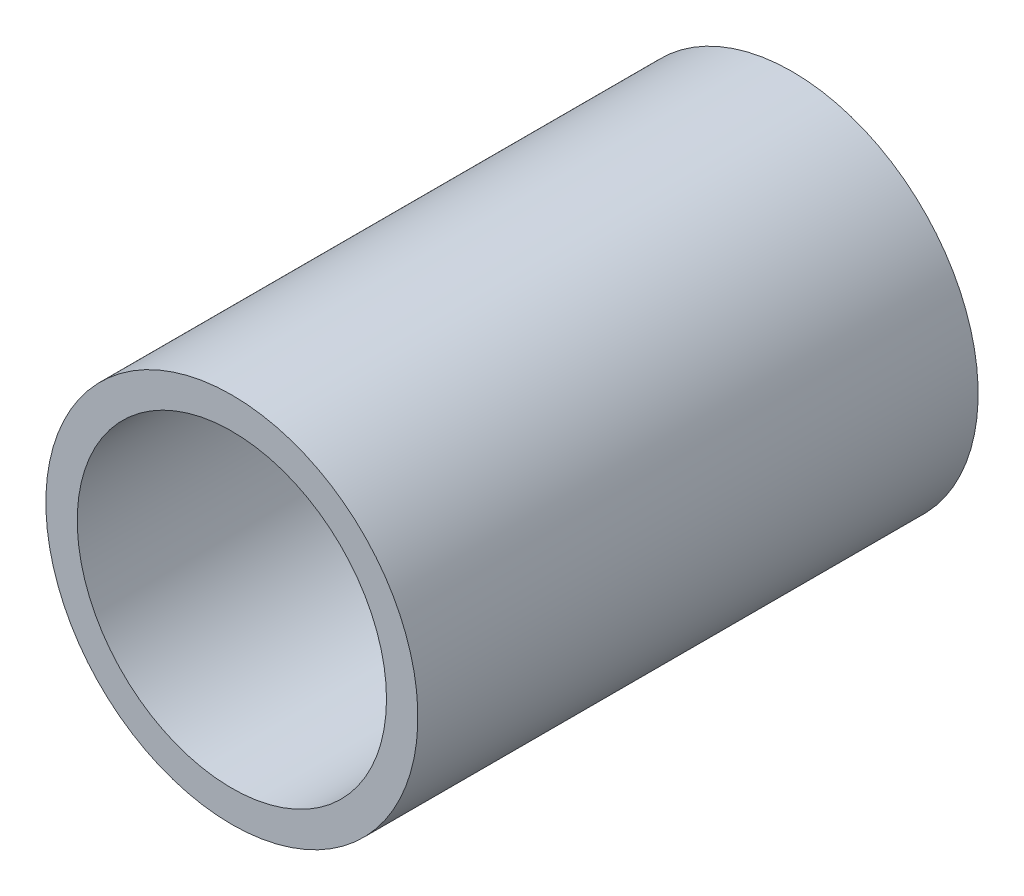
ISO-10303-21;
HEADER;
FILE_DESCRIPTION(('STEP AP214'),'2;1');
FILE_NAME('part.step','',(''),(''),'','','');
FILE_SCHEMA(('AUTOMOTIVE_DESIGN { 1 0 10303 214 1 1 1 1 }'));
ENDSEC;
DATA;
#1=APPLICATION_CONTEXT('core data for automotive mechanical design processes');
#2=APPLICATION_PROTOCOL_DEFINITION('international standard','automotive_design',2000,#1);
#3=PRODUCT_CONTEXT('',#1,'mechanical');
#4=PRODUCT('Part','Part','',(#3));
#5=PRODUCT_RELATED_PRODUCT_CATEGORY('part','',(#4));
#6=PRODUCT_DEFINITION_FORMATION('','',#4);
#7=PRODUCT_DEFINITION_CONTEXT('part definition',#1,'design');
#8=PRODUCT_DEFINITION('design','',#6,#7);
#9=PRODUCT_DEFINITION_SHAPE('','',#8);
#10=(LENGTH_UNIT() NAMED_UNIT(*) SI_UNIT(.MILLI.,.METRE.));
#11=(NAMED_UNIT(*) PLANE_ANGLE_UNIT() SI_UNIT($,.RADIAN.));
#12=(NAMED_UNIT(*) SI_UNIT($,.STERADIAN.) SOLID_ANGLE_UNIT());
#13=UNCERTAINTY_MEASURE_WITH_UNIT(LENGTH_MEASURE(1.E-05),#10,'distance_accuracy_value','');
#14=(GEOMETRIC_REPRESENTATION_CONTEXT(3) GLOBAL_UNCERTAINTY_ASSIGNED_CONTEXT((#13)) GLOBAL_UNIT_ASSIGNED_CONTEXT((#10,
#11,#12)) REPRESENTATION_CONTEXT('',''));
#15=CARTESIAN_POINT('',(0.,0.,0.));
#16=DIRECTION('',(0.,0.,1.));
#17=DIRECTION('',(1.,0.,0.));
#18=AXIS2_PLACEMENT_3D('',#15,#16,#17);
#19=CARTESIAN_POINT('',(0.,0.,0.));
#20=DIRECTION('',(0.,0.,1.));
#21=DIRECTION('',(1.,0.,0.));
#22=AXIS2_PLACEMENT_3D('',#19,#20,#21);
#23=CYLINDRICAL_SURFACE('',#22,17.526);
#24=CARTESIAN_POINT('',(0.,0.,63.5));
#25=DIRECTION('',(0.,0.,1.));
#26=DIRECTION('',(1.,0.,0.));
#27=AXIS2_PLACEMENT_3D('',#24,#25,#26);
#28=CIRCLE('',#27,17.526);
#29=CARTESIAN_POINT('',(17.526,0.,63.5));
#30=VERTEX_POINT('',#29);
#31=EDGE_CURVE('E9',#30,#30,#28,.T.);
#32=ORIENTED_EDGE('',*,*,#31,.T.);
#33=EDGE_LOOP('',(#32));
#34=FACE_BOUND('',#33,.T.);
#35=CARTESIAN_POINT('',(0.,0.,0.));
#36=DIRECTION('',(0.,0.,1.));
#37=DIRECTION('',(1.,0.,0.));
#38=AXIS2_PLACEMENT_3D('',#35,#36,#37);
#39=CIRCLE('',#38,17.526);
#40=CARTESIAN_POINT('',(17.526,0.,0.));
#41=VERTEX_POINT('',#40);
#42=EDGE_CURVE('E28',#41,#41,#39,.T.);
#43=ORIENTED_EDGE('',*,*,#42,.F.);
#44=EDGE_LOOP('',(#43));
#45=FACE_BOUND('',#44,.T.);
#46=ADVANCED_FACE('F14',(#34,#45),#23,.F.);
#47=CARTESIAN_POINT('',(0.,0.,0.));
#48=DIRECTION('',(0.,0.,1.));
#49=DIRECTION('',(1.,0.,0.));
#50=AXIS2_PLACEMENT_3D('',#47,#48,#49);
#51=CYLINDRICAL_SURFACE('',#50,21.082);
#52=CARTESIAN_POINT('',(0.,0.,63.5));
#53=DIRECTION('',(0.,0.,-1.));
#54=DIRECTION('',(0.,-1.,0.));
#55=AXIS2_PLACEMENT_3D('',#52,#53,#54);
#56=CIRCLE('',#55,21.082);
#57=CARTESIAN_POINT('',(0.,-21.082,63.5));
#58=VERTEX_POINT('',#57);
#59=EDGE_CURVE('E22',#58,#58,#56,.T.);
#60=ORIENTED_EDGE('',*,*,#59,.T.);
#61=EDGE_LOOP('',(#60));
#62=FACE_BOUND('',#61,.T.);
#63=CARTESIAN_POINT('',(0.,0.,0.));
#64=DIRECTION('',(0.,0.,-1.));
#65=DIRECTION('',(0.,-1.,0.));
#66=AXIS2_PLACEMENT_3D('',#63,#64,#65);
#67=CIRCLE('',#66,21.082);
#68=CARTESIAN_POINT('',(0.,-21.082,0.));
#69=VERTEX_POINT('',#68);
#70=EDGE_CURVE('E18',#69,#69,#67,.T.);
#71=ORIENTED_EDGE('',*,*,#70,.F.);
#72=EDGE_LOOP('',(#71));
#73=FACE_BOUND('',#72,.T.);
#74=ADVANCED_FACE('F16',(#62,#73),#51,.T.);
#75=CARTESIAN_POINT('',(0.,0.,0.));
#76=DIRECTION('',(0.,0.,1.));
#77=DIRECTION('',(1.,0.,0.));
#78=AXIS2_PLACEMENT_3D('',#75,#76,#77);
#79=PLANE('',#78);
#80=ORIENTED_EDGE('',*,*,#70,.T.);
#81=EDGE_LOOP('',(#80));
#82=FACE_BOUND('',#81,.T.);
#83=ORIENTED_EDGE('',*,*,#42,.T.);
#84=EDGE_LOOP('',(#83));
#85=FACE_BOUND('',#84,.T.);
#86=ADVANCED_FACE('F35',(#82,#85),#79,.F.);
#87=CARTESIAN_POINT('',(0.,0.,63.5));
#88=DIRECTION('',(0.,0.,1.));
#89=DIRECTION('',(1.,0.,0.));
#90=AXIS2_PLACEMENT_3D('',#87,#88,#89);
#91=PLANE('',#90);
#92=ORIENTED_EDGE('',*,*,#59,.F.);
#93=EDGE_LOOP('',(#92));
#94=FACE_BOUND('',#93,.T.);
#95=ORIENTED_EDGE('',*,*,#31,.F.);
#96=EDGE_LOOP('',(#95));
#97=FACE_BOUND('',#96,.T.);
#98=ADVANCED_FACE('F44',(#94,#97),#91,.T.);
#99=CLOSED_SHELL('',(#46,#74,#86,#98));
#100=MANIFOLD_SOLID_BREP('B1',#99);
#101=ADVANCED_BREP_SHAPE_REPRESENTATION('',(#18,#100),#14);
#102=SHAPE_DEFINITION_REPRESENTATION(#9,#101);
ENDSEC;
END-ISO-10303-21;
